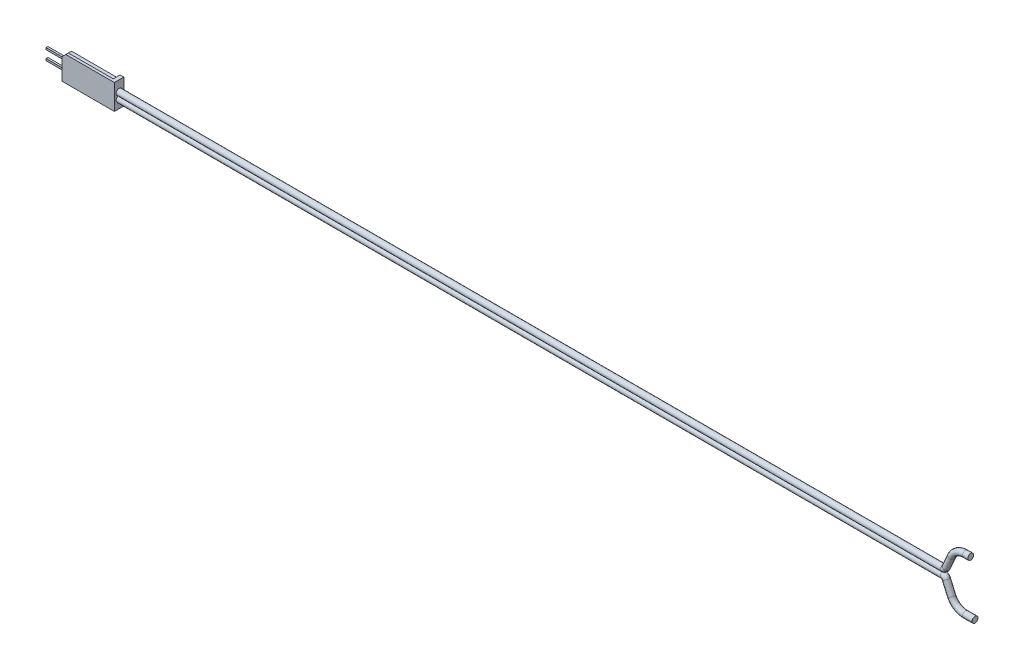
ISO-10303-21;
HEADER;
FILE_DESCRIPTION(('STEP AP214'),'2;1');
FILE_NAME('part.step','',(''),(''),'','','');
FILE_SCHEMA(('AUTOMOTIVE_DESIGN { 1 0 10303 214 1 1 1 1 }'));
ENDSEC;
DATA;
#1=APPLICATION_CONTEXT('core data for automotive mechanical design processes');
#2=APPLICATION_PROTOCOL_DEFINITION('international standard','automotive_design',2000,#1);
#3=PRODUCT_CONTEXT('',#1,'mechanical');
#4=PRODUCT('Part','Part','',(#3));
#5=PRODUCT_RELATED_PRODUCT_CATEGORY('part','',(#4));
#6=PRODUCT_DEFINITION_FORMATION('','',#4);
#7=PRODUCT_DEFINITION_CONTEXT('part definition',#1,'design');
#8=PRODUCT_DEFINITION('design','',#6,#7);
#9=PRODUCT_DEFINITION_SHAPE('','',#8);
#10=(LENGTH_UNIT() NAMED_UNIT(*) SI_UNIT(.MILLI.,.METRE.));
#11=(NAMED_UNIT(*) PLANE_ANGLE_UNIT() SI_UNIT($,.RADIAN.));
#12=(NAMED_UNIT(*) SI_UNIT($,.STERADIAN.) SOLID_ANGLE_UNIT());
#13=UNCERTAINTY_MEASURE_WITH_UNIT(LENGTH_MEASURE(1.E-05),#10,'distance_accuracy_value','');
#14=(GEOMETRIC_REPRESENTATION_CONTEXT(3) GLOBAL_UNCERTAINTY_ASSIGNED_CONTEXT((#13)) GLOBAL_UNIT_ASSIGNED_CONTEXT((#10,
#11,#12)) REPRESENTATION_CONTEXT('',''));
#15=CARTESIAN_POINT('',(0.,0.,0.));
#16=DIRECTION('',(0.,0.,1.));
#17=DIRECTION('',(1.,0.,0.));
#18=AXIS2_PLACEMENT_3D('',#15,#16,#17);
#19=CARTESIAN_POINT('',(-7.,-1.007199924,-0.25));
#20=DIRECTION('',(0.,0.,-1.));
#21=DIRECTION('',(-1.,0.,0.));
#22=AXIS2_PLACEMENT_3D('',#19,#20,#21);
#23=PLANE('',#22);
#24=DIRECTION('',(1.,0.,0.));
#25=VECTOR('',#24,1.);
#26=CARTESIAN_POINT('',(-7.,-1.507199924,-0.25));
#27=LINE('',#26,#25);
#28=CARTESIAN_POINT('',(-12.3,-1.507199924,-0.25));
#29=VERTEX_POINT('',#28);
#30=CARTESIAN_POINT('',(-7.,-1.507199924,-0.25));
#31=VERTEX_POINT('',#30);
#32=EDGE_CURVE('P0_E128',#29,#31,#27,.T.);
#33=ORIENTED_EDGE('',*,*,#32,.F.);
#34=DIRECTION('',(0.,1.,0.));
#35=VECTOR('',#34,1.);
#36=CARTESIAN_POINT('',(-12.3,-1.007199924,-0.25));
#37=LINE('',#36,#35);
#38=CARTESIAN_POINT('',(-12.3,-1.007199924,-0.25));
#39=VERTEX_POINT('',#38);
#40=EDGE_CURVE('P0_E133',#29,#39,#37,.T.);
#41=ORIENTED_EDGE('',*,*,#40,.T.);
#42=DIRECTION('',(1.,0.,0.));
#43=VECTOR('',#42,1.);
#44=CARTESIAN_POINT('',(-7.,-1.007199924,-0.25));
#45=LINE('',#44,#43);
#46=CARTESIAN_POINT('',(-7.,-1.007199924,-0.25));
#47=VERTEX_POINT('',#46);
#48=EDGE_CURVE('P0_E131',#47,#39,#45,.F.);
#49=ORIENTED_EDGE('',*,*,#48,.F.);
#50=DIRECTION('',(0.,1.,0.));
#51=VECTOR('',#50,1.);
#52=CARTESIAN_POINT('',(-7.,-1.007199924,-0.25));
#53=LINE('',#52,#51);
#54=EDGE_CURVE('P0_E20',#47,#31,#53,.F.);
#55=ORIENTED_EDGE('',*,*,#54,.T.);
#56=EDGE_LOOP('',(#33,#41,#49,#55));
#57=FACE_BOUND('',#56,.T.);
#58=ADVANCED_FACE('P0_F17',(#57),#23,.T.);
#59=CARTESIAN_POINT('',(-7.,1.532800076,-0.25));
#60=DIRECTION('',(0.,0.,-1.));
#61=DIRECTION('',(-1.,0.,0.));
#62=AXIS2_PLACEMENT_3D('',#59,#60,#61);
#63=PLANE('',#62);
#64=DIRECTION('',(1.,0.,0.));
#65=VECTOR('',#64,1.);
#66=CARTESIAN_POINT('',(-7.,1.032800076,-0.25));
#67=LINE('',#66,#65);
#68=CARTESIAN_POINT('',(-12.3,1.032800076,-0.25));
#69=VERTEX_POINT('',#68);
#70=CARTESIAN_POINT('',(-7.,1.032800076,-0.25));
#71=VERTEX_POINT('',#70);
#72=EDGE_CURVE('P0_E166',#69,#71,#67,.T.);
#73=ORIENTED_EDGE('',*,*,#72,.F.);
#74=DIRECTION('',(0.,1.,0.));
#75=VECTOR('',#74,1.);
#76=CARTESIAN_POINT('',(-12.3,1.532800076,-0.25));
#77=LINE('',#76,#75);
#78=CARTESIAN_POINT('',(-12.3,1.532800076,-0.25));
#79=VERTEX_POINT('',#78);
#80=EDGE_CURVE('P0_E147',#69,#79,#77,.T.);
#81=ORIENTED_EDGE('',*,*,#80,.T.);
#82=DIRECTION('',(1.,0.,0.));
#83=VECTOR('',#82,1.);
#84=CARTESIAN_POINT('',(-7.,1.532800076,-0.25));
#85=LINE('',#84,#83);
#86=CARTESIAN_POINT('',(-7.,1.532800076,-0.25));
#87=VERTEX_POINT('',#86);
#88=EDGE_CURVE('P0_E176',#87,#79,#85,.F.);
#89=ORIENTED_EDGE('',*,*,#88,.F.);
#90=DIRECTION('',(0.,1.,0.));
#91=VECTOR('',#90,1.);
#92=CARTESIAN_POINT('',(-7.,1.532800076,-0.25));
#93=LINE('',#92,#91);
#94=EDGE_CURVE('P0_E149',#87,#71,#93,.F.);
#95=ORIENTED_EDGE('',*,*,#94,.T.);
#96=EDGE_LOOP('',(#73,#81,#89,#95));
#97=FACE_BOUND('',#96,.T.);
#98=ADVANCED_FACE('P0_F412',(#97),#63,.T.);
#99=CARTESIAN_POINT('',(-7.,-1.507199924,-0.25));
#100=DIRECTION('',(0.,-1.,0.));
#101=DIRECTION('',(0.,0.,-1.));
#102=AXIS2_PLACEMENT_3D('',#99,#100,#101);
#103=PLANE('',#102);
#104=DIRECTION('',(1.,0.,0.));
#105=VECTOR('',#104,1.);
#106=CARTESIAN_POINT('',(-7.,-1.507199924,0.25));
#107=LINE('',#106,#105);
#108=CARTESIAN_POINT('',(-12.3,-1.507199924,0.25));
#109=VERTEX_POINT('',#108);
#110=CARTESIAN_POINT('',(-7.,-1.507199924,0.25));
#111=VERTEX_POINT('',#110);
#112=EDGE_CURVE('P0_E195',#109,#111,#107,.T.);
#113=ORIENTED_EDGE('',*,*,#112,.F.);
#114=DIRECTION('',(0.,0.,1.));
#115=VECTOR('',#114,1.);
#116=CARTESIAN_POINT('',(-12.3,-1.507199924,-1.27));
#117=LINE('',#116,#115);
#118=EDGE_CURVE('P0_E146',#29,#109,#117,.T.);
#119=ORIENTED_EDGE('',*,*,#118,.F.);
#120=ORIENTED_EDGE('',*,*,#32,.T.);
#121=DIRECTION('',(0.,0.,-1.));
#122=VECTOR('',#121,1.);
#123=CARTESIAN_POINT('',(-7.,-1.507199924,-0.25));
#124=LINE('',#123,#122);
#125=EDGE_CURVE('P0_E135',#31,#111,#124,.F.);
#126=ORIENTED_EDGE('',*,*,#125,.T.);
#127=EDGE_LOOP('',(#113,#119,#120,#126));
#128=FACE_BOUND('',#127,.T.);
#129=ADVANCED_FACE('P0_F144',(#128),#103,.T.);
#130=CARTESIAN_POINT('',(-7.,-1.007199924,0.25));
#131=DIRECTION('',(0.,1.,0.));
#132=DIRECTION('',(0.,0.,1.));
#133=AXIS2_PLACEMENT_3D('',#130,#131,#132);
#134=PLANE('',#133);
#135=ORIENTED_EDGE('',*,*,#48,.T.);
#136=DIRECTION('',(0.,0.,1.));
#137=VECTOR('',#136,1.);
#138=CARTESIAN_POINT('',(-12.3,-1.007199924,-1.27));
#139=LINE('',#138,#137);
#140=CARTESIAN_POINT('',(-12.3,-1.007199924,0.25));
#141=VERTEX_POINT('',#140);
#142=EDGE_CURVE('P0_E158',#141,#39,#139,.F.);
#143=ORIENTED_EDGE('',*,*,#142,.F.);
#144=DIRECTION('',(1.,0.,0.));
#145=VECTOR('',#144,1.);
#146=CARTESIAN_POINT('',(-7.,-1.007199924,0.25));
#147=LINE('',#146,#145);
#148=CARTESIAN_POINT('',(-7.,-1.007199924,0.25));
#149=VERTEX_POINT('',#148);
#150=EDGE_CURVE('P0_E197',#149,#141,#147,.F.);
#151=ORIENTED_EDGE('',*,*,#150,.F.);
#152=DIRECTION('',(0.,0.,1.));
#153=VECTOR('',#152,1.);
#154=CARTESIAN_POINT('',(-7.,-1.007199924,0.25));
#155=LINE('',#154,#153);
#156=EDGE_CURVE('P0_E142',#149,#47,#155,.F.);
#157=ORIENTED_EDGE('',*,*,#156,.T.);
#158=EDGE_LOOP('',(#135,#143,#151,#157));
#159=FACE_BOUND('',#158,.T.);
#160=ADVANCED_FACE('P0_F156',(#159),#134,.T.);
#161=CARTESIAN_POINT('',(-12.3,-1.257199924,-1.27));
#162=DIRECTION('',(-1.,0.,0.));
#163=DIRECTION('',(0.,0.,1.));
#164=AXIS2_PLACEMENT_3D('',#161,#162,#163);
#165=PLANE('',#164);
#166=ORIENTED_EDGE('',*,*,#118,.T.);
#167=DIRECTION('',(0.,1.,0.));
#168=VECTOR('',#167,1.);
#169=CARTESIAN_POINT('',(-12.3,-1.507199924,0.25));
#170=LINE('',#169,#168);
#171=EDGE_CURVE('P0_E163',#141,#109,#170,.F.);
#172=ORIENTED_EDGE('',*,*,#171,.F.);
#173=ORIENTED_EDGE('',*,*,#142,.T.);
#174=ORIENTED_EDGE('',*,*,#40,.F.);
#175=EDGE_LOOP('',(#166,#172,#173,#174));
#176=FACE_BOUND('',#175,.T.);
#177=ADVANCED_FACE('P0_F161',(#176),#165,.T.);
#178=CARTESIAN_POINT('',(-7.,1.032800076,-0.25));
#179=DIRECTION('',(0.,-1.,0.));
#180=DIRECTION('',(0.,0.,-1.));
#181=AXIS2_PLACEMENT_3D('',#178,#179,#180);
#182=PLANE('',#181);
#183=DIRECTION('',(1.,0.,0.));
#184=VECTOR('',#183,1.);
#185=CARTESIAN_POINT('',(-7.,1.032800076,0.25));
#186=LINE('',#185,#184);
#187=CARTESIAN_POINT('',(-12.3,1.032800076,0.25));
#188=VERTEX_POINT('',#187);
#189=CARTESIAN_POINT('',(-7.,1.032800076,0.25));
#190=VERTEX_POINT('',#189);
#191=EDGE_CURVE('P0_E200',#188,#190,#186,.T.);
#192=ORIENTED_EDGE('',*,*,#191,.F.);
#193=DIRECTION('',(0.,0.,1.));
#194=VECTOR('',#193,1.);
#195=CARTESIAN_POINT('',(-12.3,1.032800076,-1.27));
#196=LINE('',#195,#194);
#197=EDGE_CURVE('P0_E182',#69,#188,#196,.T.);
#198=ORIENTED_EDGE('',*,*,#197,.F.);
#199=ORIENTED_EDGE('',*,*,#72,.T.);
#200=DIRECTION('',(0.,0.,-1.));
#201=VECTOR('',#200,1.);
#202=CARTESIAN_POINT('',(-7.,1.032800076,-0.25));
#203=LINE('',#202,#201);
#204=EDGE_CURVE('P0_E171',#71,#190,#203,.F.);
#205=ORIENTED_EDGE('',*,*,#204,.T.);
#206=EDGE_LOOP('',(#192,#198,#199,#205));
#207=FACE_BOUND('',#206,.T.);
#208=ADVANCED_FACE('P0_F385',(#207),#182,.T.);
#209=CARTESIAN_POINT('',(-7.,1.532800076,0.25));
#210=DIRECTION('',(0.,1.,0.));
#211=DIRECTION('',(0.,0.,1.));
#212=AXIS2_PLACEMENT_3D('',#209,#210,#211);
#213=PLANE('',#212);
#214=ORIENTED_EDGE('',*,*,#88,.T.);
#215=DIRECTION('',(0.,0.,1.));
#216=VECTOR('',#215,1.);
#217=CARTESIAN_POINT('',(-12.3,1.532800076,-1.27));
#218=LINE('',#217,#216);
#219=CARTESIAN_POINT('',(-12.3,1.532800076,0.25));
#220=VERTEX_POINT('',#219);
#221=EDGE_CURVE('P0_E179',#220,#79,#218,.F.);
#222=ORIENTED_EDGE('',*,*,#221,.F.);
#223=DIRECTION('',(1.,0.,0.));
#224=VECTOR('',#223,1.);
#225=CARTESIAN_POINT('',(-7.,1.532800076,0.25));
#226=LINE('',#225,#224);
#227=CARTESIAN_POINT('',(-7.,1.532800076,0.25));
#228=VERTEX_POINT('',#227);
#229=EDGE_CURVE('P0_E203',#228,#220,#226,.F.);
#230=ORIENTED_EDGE('',*,*,#229,.F.);
#231=DIRECTION('',(0.,0.,1.));
#232=VECTOR('',#231,1.);
#233=CARTESIAN_POINT('',(-7.,1.532800076,0.25));
#234=LINE('',#233,#232);
#235=EDGE_CURVE('P0_E173',#228,#87,#234,.F.);
#236=ORIENTED_EDGE('',*,*,#235,.T.);
#237=EDGE_LOOP('',(#214,#222,#230,#236));
#238=FACE_BOUND('',#237,.T.);
#239=ADVANCED_FACE('P0_F297',(#238),#213,.T.);
#240=CARTESIAN_POINT('',(-12.3,-1.257199924,-1.27));
#241=DIRECTION('',(-1.,0.,0.));
#242=DIRECTION('',(0.,0.,1.));
#243=AXIS2_PLACEMENT_3D('',#240,#241,#242);
#244=PLANE('',#243);
#245=ORIENTED_EDGE('',*,*,#197,.T.);
#246=DIRECTION('',(0.,1.,0.));
#247=VECTOR('',#246,1.);
#248=CARTESIAN_POINT('',(-12.3,1.032800076,0.25));
#249=LINE('',#248,#247);
#250=EDGE_CURVE('P0_E206',#220,#188,#249,.F.);
#251=ORIENTED_EDGE('',*,*,#250,.F.);
#252=ORIENTED_EDGE('',*,*,#221,.T.);
#253=ORIENTED_EDGE('',*,*,#80,.F.);
#254=EDGE_LOOP('',(#245,#251,#252,#253));
#255=FACE_BOUND('',#254,.T.);
#256=ADVANCED_FACE('P0_F289',(#255),#244,.T.);
#257=CARTESIAN_POINT('',(6.,2.592800076,-2.68421356237309));
#258=DIRECTION('',(1.,0.,0.));
#259=DIRECTION('',(0.,0.,-1.));
#260=AXIS2_PLACEMENT_3D('',#257,#258,#259);
#261=PLANE('',#260);
#262=DIRECTION('',(0.,1.,0.));
#263=VECTOR('',#262,1.);
#264=CARTESIAN_POINT('',(6.,-1.257199924,-1.27));
#265=LINE('',#264,#263);
#266=CARTESIAN_POINT('',(6.,3.592800076,-1.27));
#267=VERTEX_POINT('',#266);
#268=CARTESIAN_POINT('',(6.,2.592800076,-1.27));
#269=VERTEX_POINT('',#268);
#270=EDGE_CURVE('P0_E209',#267,#269,#265,.F.);
#271=ORIENTED_EDGE('',*,*,#270,.T.);
#272=DIRECTION('',(0.,0.,1.));
#273=VECTOR('',#272,1.);
#274=CARTESIAN_POINT('',(6.,2.592800076,-1.27));
#275=LINE('',#274,#273);
#276=CARTESIAN_POINT('',(6.,2.592800076,0.57));
#277=VERTEX_POINT('',#276);
#278=EDGE_CURVE('P0_E192',#277,#269,#275,.F.);
#279=ORIENTED_EDGE('',*,*,#278,.F.);
#280=DIRECTION('',(0.,1.,0.));
#281=VECTOR('',#280,1.);
#282=CARTESIAN_POINT('',(6.,2.592800076,0.57));
#283=LINE('',#282,#281);
#284=CARTESIAN_POINT('',(6.,3.592800076,0.57));
#285=VERTEX_POINT('',#284);
#286=EDGE_CURVE('P0_E185',#285,#277,#283,.F.);
#287=ORIENTED_EDGE('',*,*,#286,.F.);
#288=DIRECTION('',(0.,0.,1.));
#289=VECTOR('',#288,1.);
#290=CARTESIAN_POINT('',(6.,3.592800076,0.47));
#291=LINE('',#290,#289);
#292=EDGE_CURVE('P0_E213',#267,#285,#291,.T.);
#293=ORIENTED_EDGE('',*,*,#292,.F.);
#294=EDGE_LOOP('',(#271,#279,#287,#293));
#295=FACE_BOUND('',#294,.T.);
#296=ADVANCED_FACE('P0_F287',(#295),#261,.F.);
#297=CARTESIAN_POINT('',(6.,2.592800076,0.57));
#298=DIRECTION('',(0.,0.,-1.));
#299=DIRECTION('',(-1.,0.,0.));
#300=AXIS2_PLACEMENT_3D('',#297,#298,#299);
#301=PLANE('',#300);
#302=DIRECTION('',(0.707106781186549,0.707106781186546,0.));
#303=VECTOR('',#302,1.);
#304=CARTESIAN_POINT('',(-7.,2.592800076,0.57));
#305=LINE('',#304,#303);
#306=CARTESIAN_POINT('',(-7.00000000000001,2.592800076,0.57));
#307=VERTEX_POINT('',#306);
#308=CARTESIAN_POINT('',(-6.,3.592800076,0.57));
#309=VERTEX_POINT('',#308);
#310=EDGE_CURVE('P0_E187',#307,#309,#305,.T.);
#311=ORIENTED_EDGE('',*,*,#310,.T.);
#312=DIRECTION('',(1.,0.,0.));
#313=VECTOR('',#312,1.);
#314=CARTESIAN_POINT('',(-7.,3.592800076,0.57));
#315=LINE('',#314,#313);
#316=EDGE_CURVE('P0_E216',#285,#309,#315,.F.);
#317=ORIENTED_EDGE('',*,*,#316,.F.);
#318=ORIENTED_EDGE('',*,*,#286,.T.);
#319=DIRECTION('',(1.,0.,0.));
#320=VECTOR('',#319,1.);
#321=CARTESIAN_POINT('',(7.,2.592800076,0.57));
#322=LINE('',#321,#320);
#323=EDGE_CURVE('P0_E189',#307,#277,#322,.T.);
#324=ORIENTED_EDGE('',*,*,#323,.F.);
#325=EDGE_LOOP('',(#311,#317,#318,#324));
#326=FACE_BOUND('',#325,.T.);
#327=ADVANCED_FACE('P0_F282',(#326),#301,.T.);
#328=CARTESIAN_POINT('',(7.,2.592800076,-1.27));
#329=DIRECTION('',(0.,1.,0.));
#330=DIRECTION('',(0.,0.,1.));
#331=AXIS2_PLACEMENT_3D('',#328,#329,#330);
#332=PLANE('',#331);
#333=ORIENTED_EDGE('',*,*,#278,.T.);
#334=DIRECTION('',(1.,0.,0.));
#335=VECTOR('',#334,1.);
#336=CARTESIAN_POINT('',(0.,2.592800076,-1.27));
#337=LINE('',#336,#335);
#338=CARTESIAN_POINT('',(-7.,2.592800076,-1.27));
#339=VERTEX_POINT('',#338);
#340=EDGE_CURVE('P0_E211',#269,#339,#337,.F.);
#341=ORIENTED_EDGE('',*,*,#340,.T.);
#342=DIRECTION('',(0.,0.,1.));
#343=VECTOR('',#342,1.);
#344=CARTESIAN_POINT('',(-7.,2.592800076,-1.27));
#345=LINE('',#344,#343);
#346=EDGE_CURVE('P0_E227',#307,#339,#345,.F.);
#347=ORIENTED_EDGE('',*,*,#346,.F.);
#348=ORIENTED_EDGE('',*,*,#323,.T.);
#349=EDGE_LOOP('',(#333,#341,#347,#348));
#350=FACE_BOUND('',#349,.T.);
#351=ADVANCED_FACE('P0_F285',(#350),#332,.T.);
#352=CARTESIAN_POINT('',(-7.,-1.507199924,0.25));
#353=DIRECTION('',(0.,0.,1.));
#354=DIRECTION('',(1.,0.,0.));
#355=AXIS2_PLACEMENT_3D('',#352,#353,#354);
#356=PLANE('',#355);
#357=ORIENTED_EDGE('',*,*,#150,.T.);
#358=ORIENTED_EDGE('',*,*,#171,.T.);
#359=ORIENTED_EDGE('',*,*,#112,.T.);
#360=DIRECTION('',(0.,1.,0.));
#361=VECTOR('',#360,1.);
#362=CARTESIAN_POINT('',(-7.,2.592800076,0.25));
#363=LINE('',#362,#361);
#364=EDGE_CURVE('P0_E139',#149,#111,#363,.F.);
#365=ORIENTED_EDGE('',*,*,#364,.F.);
#366=EDGE_LOOP('',(#357,#358,#359,#365));
#367=FACE_BOUND('',#366,.T.);
#368=ADVANCED_FACE('P0_F321',(#367),#356,.T.);
#369=CARTESIAN_POINT('',(-7.,1.032800076,0.25));
#370=DIRECTION('',(0.,0.,1.));
#371=DIRECTION('',(1.,0.,0.));
#372=AXIS2_PLACEMENT_3D('',#369,#370,#371);
#373=PLANE('',#372);
#374=ORIENTED_EDGE('',*,*,#229,.T.);
#375=ORIENTED_EDGE('',*,*,#250,.T.);
#376=ORIENTED_EDGE('',*,*,#191,.T.);
#377=DIRECTION('',(0.,1.,0.));
#378=VECTOR('',#377,1.);
#379=CARTESIAN_POINT('',(-7.,2.592800076,0.25));
#380=LINE('',#379,#378);
#381=EDGE_CURVE('P0_E233',#228,#190,#380,.F.);
#382=ORIENTED_EDGE('',*,*,#381,.F.);
#383=EDGE_LOOP('',(#374,#375,#376,#382));
#384=FACE_BOUND('',#383,.T.);
#385=ADVANCED_FACE('P0_F318',(#384),#373,.T.);
#386=CARTESIAN_POINT('',(0.,-1.257199924,-1.27));
#387=DIRECTION('',(0.,0.,1.));
#388=DIRECTION('',(1.,0.,0.));
#389=AXIS2_PLACEMENT_3D('',#386,#387,#388);
#390=PLANE('',#389);
#391=DIRECTION('',(1.,0.,0.));
#392=VECTOR('',#391,1.);
#393=CARTESIAN_POINT('',(156.887568848328,-3.107199924,-1.27));
#394=LINE('',#393,#392);
#395=CARTESIAN_POINT('',(7.,-3.107199924,-1.27));
#396=VERTEX_POINT('',#395);
#397=CARTESIAN_POINT('',(-7.,-3.107199924,-1.27));
#398=VERTEX_POINT('',#397);
#399=EDGE_CURVE('P0_E238',#396,#398,#394,.F.);
#400=ORIENTED_EDGE('',*,*,#399,.T.);
#401=DIRECTION('',(0.,1.,0.));
#402=VECTOR('',#401,1.);
#403=CARTESIAN_POINT('',(-7.,2.592800076,-1.27));
#404=LINE('',#403,#402);
#405=EDGE_CURVE('P0_E230',#339,#398,#404,.F.);
#406=ORIENTED_EDGE('',*,*,#405,.F.);
#407=ORIENTED_EDGE('',*,*,#340,.F.);
#408=ORIENTED_EDGE('',*,*,#270,.F.);
#409=DIRECTION('',(1.,0.,0.));
#410=VECTOR('',#409,1.);
#411=CARTESIAN_POINT('',(-7.,3.592800076,-1.27));
#412=LINE('',#411,#410);
#413=CARTESIAN_POINT('',(7.,3.592800076,-1.27));
#414=VERTEX_POINT('',#413);
#415=EDGE_CURVE('P0_E219',#414,#267,#412,.F.);
#416=ORIENTED_EDGE('',*,*,#415,.F.);
#417=DIRECTION('',(0.,1.,0.));
#418=VECTOR('',#417,1.);
#419=CARTESIAN_POINT('',(7.,-5.107199924,-1.27));
#420=LINE('',#419,#418);
#421=EDGE_CURVE('P0_E242',#396,#414,#420,.T.);
#422=ORIENTED_EDGE('',*,*,#421,.F.);
#423=EDGE_LOOP('',(#400,#406,#407,#408,#416,#422));
#424=FACE_BOUND('',#423,.T.);
#425=ADVANCED_FACE('P0_F268',(#424),#390,.F.);
#426=CARTESIAN_POINT('',(-7.,3.592800076,0.47));
#427=DIRECTION('',(0.,1.,0.));
#428=DIRECTION('',(0.,0.,1.));
#429=AXIS2_PLACEMENT_3D('',#426,#427,#428);
#430=PLANE('',#429);
#431=DIRECTION('',(0.,0.,-1.));
#432=VECTOR('',#431,1.);
#433=CARTESIAN_POINT('',(7.,3.592800076,-1.27));
#434=LINE('',#433,#432);
#435=CARTESIAN_POINT('',(7.,3.592800076,1.27));
#436=VERTEX_POINT('',#435);
#437=EDGE_CURVE('P0_E245',#414,#436,#434,.F.);
#438=ORIENTED_EDGE('',*,*,#437,.F.);
#439=ORIENTED_EDGE('',*,*,#415,.T.);
#440=ORIENTED_EDGE('',*,*,#292,.T.);
#441=ORIENTED_EDGE('',*,*,#316,.T.);
#442=DIRECTION('',(0.,0.,1.));
#443=VECTOR('',#442,1.);
#444=CARTESIAN_POINT('',(-6.,3.592800076,-1.27));
#445=LINE('',#444,#443);
#446=CARTESIAN_POINT('',(-6.,3.592800076,1.27));
#447=VERTEX_POINT('',#446);
#448=EDGE_CURVE('P0_E222',#309,#447,#445,.T.);
#449=ORIENTED_EDGE('',*,*,#448,.T.);
#450=DIRECTION('',(1.,0.,0.));
#451=VECTOR('',#450,1.);
#452=CARTESIAN_POINT('',(0.,3.592800076,1.27));
#453=LINE('',#452,#451);
#454=EDGE_CURVE('P0_E248',#436,#447,#453,.F.);
#455=ORIENTED_EDGE('',*,*,#454,.F.);
#456=EDGE_LOOP('',(#438,#439,#440,#441,#449,#455));
#457=FACE_BOUND('',#456,.T.);
#458=ADVANCED_FACE('P0_F274',(#457),#430,.T.);
#459=CARTESIAN_POINT('',(-7.,2.592800076,-1.27));
#460=DIRECTION('',(0.707106781186546,-0.707106781186549,0.));
#461=DIRECTION('',(0.707106781186549,0.707106781186546,0.));
#462=AXIS2_PLACEMENT_3D('',#459,#460,#461);
#463=PLANE('',#462);
#464=ORIENTED_EDGE('',*,*,#310,.F.);
#465=DIRECTION('',(0.,0.,1.));
#466=VECTOR('',#465,1.);
#467=CARTESIAN_POINT('',(-7.,2.592800076,-1.27));
#468=LINE('',#467,#466);
#469=CARTESIAN_POINT('',(-7.,2.592800076,1.27));
#470=VERTEX_POINT('',#469);
#471=EDGE_CURVE('P0_E224',#470,#307,#468,.F.);
#472=ORIENTED_EDGE('',*,*,#471,.F.);
#473=DIRECTION('',(-0.707106781186549,-0.707106781186546,0.));
#474=VECTOR('',#473,1.);
#475=CARTESIAN_POINT('',(-6.,3.592800076,1.27));
#476=LINE('',#475,#474);
#477=EDGE_CURVE('P0_E251',#447,#470,#476,.T.);
#478=ORIENTED_EDGE('',*,*,#477,.F.);
#479=ORIENTED_EDGE('',*,*,#448,.F.);
#480=EDGE_LOOP('',(#464,#472,#478,#479));
#481=FACE_BOUND('',#480,.T.);
#482=ADVANCED_FACE('P0_F278',(#481),#463,.F.);
#483=CARTESIAN_POINT('',(-7.,2.592800076,-1.27));
#484=DIRECTION('',(-1.,0.,0.));
#485=DIRECTION('',(0.,0.,1.));
#486=AXIS2_PLACEMENT_3D('',#483,#484,#485);
#487=PLANE('',#486);
#488=ORIENTED_EDGE('',*,*,#235,.F.);
#489=ORIENTED_EDGE('',*,*,#381,.T.);
#490=ORIENTED_EDGE('',*,*,#204,.F.);
#491=ORIENTED_EDGE('',*,*,#94,.F.);
#492=EDGE_LOOP('',(#488,#489,#490,#491));
#493=FACE_BOUND('',#492,.T.);
#494=ORIENTED_EDGE('',*,*,#156,.F.);
#495=ORIENTED_EDGE('',*,*,#364,.T.);
#496=ORIENTED_EDGE('',*,*,#125,.F.);
#497=ORIENTED_EDGE('',*,*,#54,.F.);
#498=EDGE_LOOP('',(#494,#495,#496,#497));
#499=FACE_BOUND('',#498,.T.);
#500=ORIENTED_EDGE('',*,*,#405,.T.);
#501=DIRECTION('',(0.,0.,1.));
#502=VECTOR('',#501,1.);
#503=CARTESIAN_POINT('',(-7.00000000000001,-3.107199924,1.27));
#504=LINE('',#503,#502);
#505=CARTESIAN_POINT('',(-7.,-3.107199924,1.27));
#506=VERTEX_POINT('',#505);
#507=EDGE_CURVE('P0_E236',#398,#506,#504,.T.);
#508=ORIENTED_EDGE('',*,*,#507,.T.);
#509=DIRECTION('',(0.,1.,0.));
#510=VECTOR('',#509,1.);
#511=CARTESIAN_POINT('',(-7.,-1.257199924,1.27));
#512=LINE('',#511,#510);
#513=EDGE_CURVE('P0_E254',#470,#506,#512,.F.);
#514=ORIENTED_EDGE('',*,*,#513,.F.);
#515=ORIENTED_EDGE('',*,*,#471,.T.);
#516=ORIENTED_EDGE('',*,*,#346,.T.);
#517=EDGE_LOOP('',(#500,#508,#514,#515,#516));
#518=FACE_BOUND('',#517,.T.);
#519=ADVANCED_FACE('P0_F136',(#493,#499,#518),#487,.T.);
#520=CARTESIAN_POINT('',(156.887568848328,-3.107199924,1.27));
#521=DIRECTION('',(0.,1.,0.));
#522=DIRECTION('',(0.,0.,1.));
#523=AXIS2_PLACEMENT_3D('',#520,#521,#522);
#524=PLANE('',#523);
#525=DIRECTION('',(0.,0.,-1.));
#526=VECTOR('',#525,1.);
#527=CARTESIAN_POINT('',(7.,-3.107199924,-1.27));
#528=LINE('',#527,#526);
#529=CARTESIAN_POINT('',(7.,-3.107199924,1.27));
#530=VERTEX_POINT('',#529);
#531=EDGE_CURVE('P0_E35',#530,#396,#528,.T.);
#532=ORIENTED_EDGE('',*,*,#531,.F.);
#533=DIRECTION('',(1.,0.,0.));
#534=VECTOR('',#533,1.);
#535=CARTESIAN_POINT('',(0.,-3.107199924,1.27));
#536=LINE('',#535,#534);
#537=EDGE_CURVE('P0_E26',#506,#530,#536,.T.);
#538=ORIENTED_EDGE('',*,*,#537,.F.);
#539=ORIENTED_EDGE('',*,*,#507,.F.);
#540=ORIENTED_EDGE('',*,*,#399,.F.);
#541=EDGE_LOOP('',(#532,#538,#539,#540));
#542=FACE_BOUND('',#541,.T.);
#543=ADVANCED_FACE('P0_F262',(#542),#524,.F.);
#544=CARTESIAN_POINT('',(7.,-5.107199924,-1.27));
#545=DIRECTION('',(1.,0.,0.));
#546=DIRECTION('',(0.,0.,-1.));
#547=AXIS2_PLACEMENT_3D('',#544,#545,#546);
#548=PLANE('',#547);
#549=ORIENTED_EDGE('',*,*,#437,.T.);
#550=DIRECTION('',(0.,1.,0.));
#551=VECTOR('',#550,1.);
#552=CARTESIAN_POINT('',(7.,-1.257199924,1.27));
#553=LINE('',#552,#551);
#554=EDGE_CURVE('P0_E11',#530,#436,#553,.T.);
#555=ORIENTED_EDGE('',*,*,#554,.F.);
#556=ORIENTED_EDGE('',*,*,#531,.T.);
#557=ORIENTED_EDGE('',*,*,#421,.T.);
#558=EDGE_LOOP('',(#549,#555,#556,#557));
#559=FACE_BOUND('',#558,.T.);
#560=ADVANCED_FACE('P0_F272',(#559),#548,.T.);
#561=CARTESIAN_POINT('',(0.,-1.257199924,1.27));
#562=DIRECTION('',(0.,0.,1.));
#563=DIRECTION('',(1.,0.,0.));
#564=AXIS2_PLACEMENT_3D('',#561,#562,#563);
#565=PLANE('',#564);
#566=ORIENTED_EDGE('',*,*,#537,.T.);
#567=ORIENTED_EDGE('',*,*,#554,.T.);
#568=ORIENTED_EDGE('',*,*,#454,.T.);
#569=ORIENTED_EDGE('',*,*,#477,.T.);
#570=ORIENTED_EDGE('',*,*,#513,.T.);
#571=EDGE_LOOP('',(#566,#567,#568,#569,#570));
#572=FACE_BOUND('',#571,.T.);
#573=ADVANCED_FACE('P0_F259',(#572),#565,.T.);
#574=CLOSED_SHELL('',(#58,#98,#129,#160,#177,#208,#239,#256,#296,#327,#351,#368,#385,#425,#458,
#482,#519,#543,#560,#573));
#575=MANIFOLD_SOLID_BREP('P0_B1',#574);
#576=CARTESIAN_POINT('',(235.91,-6.99686707171975,0.));
#577=DIRECTION('',(1.,0.,0.));
#578=DIRECTION('',(0.,1.,0.));
#579=AXIS2_PLACEMENT_3D('',#576,#577,#578);
#580=PLANE('',#579);
#581=CARTESIAN_POINT('',(235.91,-6.99686707171975,0.));
#582=DIRECTION('',(1.,0.,0.));
#583=DIRECTION('',(0.,1.,0.));
#584=AXIS2_PLACEMENT_3D('',#581,#582,#583);
#585=CIRCLE('',#584,0.800000000000006);
#586=CARTESIAN_POINT('',(235.91,-6.19686707171974,0.));
#587=VERTEX_POINT('',#586);
#588=EDGE_CURVE('P1_E18',#587,#587,#585,.F.);
#589=ORIENTED_EDGE('',*,*,#588,.F.);
#590=EDGE_LOOP('',(#589));
#591=FACE_BOUND('',#590,.T.);
#592=ADVANCED_FACE('P1_F15',(#591),#580,.T.);
#593=CARTESIAN_POINT('',(233.37,-6.99686707171976,0.));
#594=DIRECTION('',(1.,0.,0.));
#595=DIRECTION('',(0.,1.,0.));
#596=AXIS2_PLACEMENT_3D('',#593,#594,#595);
#597=CYLINDRICAL_SURFACE('',#596,0.800000000000006);
#598=CARTESIAN_POINT('',(233.37,-6.99686707171976,0.));
#599=DIRECTION('',(1.,0.,0.));
#600=DIRECTION('',(0.,-1.,0.));
#601=AXIS2_PLACEMENT_3D('',#598,#599,#600);
#602=CIRCLE('',#601,0.800000000000006);
#603=CARTESIAN_POINT('',(233.37,-7.79686707171976,0.));
#604=VERTEX_POINT('',#603);
#605=EDGE_CURVE('P1_E34',#604,#604,#602,.F.);
#606=ORIENTED_EDGE('',*,*,#605,.F.);
#607=EDGE_LOOP('',(#606));
#608=FACE_BOUND('',#607,.T.);
#609=ORIENTED_EDGE('',*,*,#588,.T.);
#610=EDGE_LOOP('',(#609));
#611=FACE_BOUND('',#610,.T.);
#612=ADVANCED_FACE('P1_F43',(#608,#611),#597,.T.);
#613=CARTESIAN_POINT('',(233.37,-2.9207146987759,0.));
#614=DIRECTION('',(0.,0.,1.));
#615=DIRECTION('',(1.,0.,0.));
#616=AXIS2_PLACEMENT_3D('',#613,#614,#615);
#617=TOROIDAL_SURFACE('',#616,4.07615237294387,0.800000000000006);
#618=CARTESIAN_POINT('',(229.636644149097,-4.55689080726305,0.));
#619=DIRECTION('',(0.401402096581953,-0.915901936268077,0.));
#620=DIRECTION('',(0.915901936268077,0.401402096581953,0.));
#621=AXIS2_PLACEMENT_3D('',#618,#619,#620);
#622=CIRCLE('',#621,0.800000000000004);
#623=CARTESIAN_POINT('',(230.369365698111,-4.23576912999749,0.));
#624=VERTEX_POINT('',#623);
#625=EDGE_CURVE('P1_E31',#624,#624,#622,.F.);
#626=ORIENTED_EDGE('',*,*,#625,.F.);
#627=EDGE_LOOP('',(#626));
#628=FACE_BOUND('',#627,.T.);
#629=ORIENTED_EDGE('',*,*,#605,.T.);
#630=EDGE_LOOP('',(#629));
#631=FACE_BOUND('',#630,.T.);
#632=ADVANCED_FACE('P1_F39',(#628,#631),#617,.T.);
#633=CARTESIAN_POINT('',(228.220817134888,-1.32631798570251,0.));
#634=DIRECTION('',(0.401402096581953,-0.915901936268077,0.));
#635=DIRECTION('',(0.915901936268077,0.401402096581953,0.));
#636=AXIS2_PLACEMENT_3D('',#633,#634,#635);
#637=CYLINDRICAL_SURFACE('',#636,0.800000000000004);
#638=CARTESIAN_POINT('',(228.220817134888,-1.32631798570254,0.));
#639=DIRECTION('',(0.401402096581974,-0.915901936268068,0.));
#640=DIRECTION('',(0.915901936268068,0.401402096581974,0.));
#641=AXIS2_PLACEMENT_3D('',#638,#639,#640);
#642=CIRCLE('',#641,0.800000000000006);
#643=CARTESIAN_POINT('',(228.953538683902,-1.00519630843696,0.));
#644=VERTEX_POINT('',#643);
#645=EDGE_CURVE('P1_E27',#644,#644,#642,.F.);
#646=ORIENTED_EDGE('',*,*,#645,.F.);
#647=EDGE_LOOP('',(#646));
#648=FACE_BOUND('',#647,.T.);
#649=ORIENTED_EDGE('',*,*,#625,.T.);
#650=EDGE_LOOP('',(#649));
#651=FACE_BOUND('',#650,.T.);
#652=ADVANCED_FACE('P1_F42',(#648,#651),#637,.T.);
#653=CARTESIAN_POINT('',(7.01,-0.799999924,0.));
#654=DIRECTION('',(1.,0.,0.));
#655=DIRECTION('',(0.,0.,-1.));
#656=AXIS2_PLACEMENT_3D('',#653,#654,#655);
#657=PLANE('',#656);
#658=CARTESIAN_POINT('',(7.01,-0.799999924000001,0.));
#659=DIRECTION('',(1.,0.,0.));
#660=DIRECTION('',(0.,1.,0.));
#661=AXIS2_PLACEMENT_3D('',#658,#659,#660);
#662=CIRCLE('',#661,0.800000000000006);
#663=CARTESIAN_POINT('',(7.01,7.6000004683649E-08,0.));
#664=VERTEX_POINT('',#663);
#665=EDGE_CURVE('P1_E22',#664,#664,#662,.T.);
#666=ORIENTED_EDGE('',*,*,#665,.F.);
#667=EDGE_LOOP('',(#666));
#668=FACE_BOUND('',#667,.T.);
#669=ADVANCED_FACE('P1_F63',(#668),#657,.F.);
#670=CARTESIAN_POINT('',(227.41550904902,-1.67925135254194,0.));
#671=DIRECTION('',(0.,0.,-1.));
#672=DIRECTION('',(-1.,0.,0.));
#673=AXIS2_PLACEMENT_3D('',#670,#671,#672);
#674=TOROIDAL_SURFACE('',#673,0.879251428541838,0.800000000000006);
#675=ORIENTED_EDGE('',*,*,#645,.T.);
#676=EDGE_LOOP('',(#675));
#677=FACE_BOUND('',#676,.T.);
#678=CARTESIAN_POINT('',(227.41550904902,-0.799999924000377,-3.17731900053205E-13));
#679=DIRECTION('',(1.,0.,0.));
#680=DIRECTION('',(0.,1.,0.));
#681=AXIS2_PLACEMENT_3D('',#678,#679,#680);
#682=CIRCLE('',#681,0.800000000000006);
#683=CARTESIAN_POINT('',(227.41550904902,7.59996287907558E-08,-3.17731900053205E-13));
#684=VERTEX_POINT('',#683);
#685=EDGE_CURVE('P1_E10',#684,#684,#682,.F.);
#686=ORIENTED_EDGE('',*,*,#685,.F.);
#687=EDGE_LOOP('',(#686));
#688=FACE_BOUND('',#687,.T.);
#689=ADVANCED_FACE('P1_F57',(#677,#688),#674,.T.);
#690=CARTESIAN_POINT('',(6.01,-0.799999924,0.));
#691=DIRECTION('',(1.,0.,0.));
#692=DIRECTION('',(0.,1.,0.));
#693=AXIS2_PLACEMENT_3D('',#690,#691,#692);
#694=CYLINDRICAL_SURFACE('',#693,0.800000000000006);
#695=ORIENTED_EDGE('',*,*,#665,.T.);
#696=EDGE_LOOP('',(#695));
#697=FACE_BOUND('',#696,.T.);
#698=ORIENTED_EDGE('',*,*,#685,.T.);
#699=EDGE_LOOP('',(#698));
#700=FACE_BOUND('',#699,.T.);
#701=ADVANCED_FACE('P1_F55',(#697,#700),#694,.T.);
#702=CLOSED_SHELL('',(#592,#612,#632,#652,#669,#689,#701));
#703=MANIFOLD_SOLID_BREP('P1_B1',#702);
#704=CARTESIAN_POINT('',(234.771596629542,6.99686714772079,8.55189900363326E-13));
#705=DIRECTION('',(1.,0.,0.));
#706=DIRECTION('',(0.,1.,0.));
#707=AXIS2_PLACEMENT_3D('',#704,#705,#706);
#708=PLANE('',#707);
#709=CARTESIAN_POINT('',(234.771596629542,6.99686714772079,8.55189900363326E-13));
#710=DIRECTION('',(1.,0.,0.));
#711=DIRECTION('',(0.,1.,0.));
#712=AXIS2_PLACEMENT_3D('',#709,#710,#711);
#713=CIRCLE('',#712,0.799999999999449);
#714=CARTESIAN_POINT('',(234.771596629542,7.79686714772024,8.55189900363326E-13));
#715=VERTEX_POINT('',#714);
#716=EDGE_CURVE('P2_E18',#715,#715,#713,.F.);
#717=ORIENTED_EDGE('',*,*,#716,.F.);
#718=EDGE_LOOP('',(#717));
#719=FACE_BOUND('',#718,.T.);
#720=ADVANCED_FACE('P2_F15',(#719),#708,.T.);
#721=CARTESIAN_POINT('',(233.37,6.9968671477208,8.55189900363326E-13));
#722=DIRECTION('',(1.,0.,0.));
#723=DIRECTION('',(0.,1.,0.));
#724=AXIS2_PLACEMENT_3D('',#721,#722,#723);
#725=CYLINDRICAL_SURFACE('',#724,0.799999999999449);
#726=CARTESIAN_POINT('',(233.37,6.99686714772077,8.55189900363326E-13));
#727=DIRECTION('',(1.,0.,0.));
#728=DIRECTION('',(0.,1.,0.));
#729=AXIS2_PLACEMENT_3D('',#726,#727,#728);
#730=CIRCLE('',#729,0.799999999999449);
#731=CARTESIAN_POINT('',(233.37,7.79686714772022,8.55189900363326E-13));
#732=VERTEX_POINT('',#731);
#733=EDGE_CURVE('P2_E79',#732,#732,#730,.F.);
#734=ORIENTED_EDGE('',*,*,#733,.F.);
#735=EDGE_LOOP('',(#734));
#736=FACE_BOUND('',#735,.T.);
#737=ORIENTED_EDGE('',*,*,#716,.T.);
#738=EDGE_LOOP('',(#737));
#739=FACE_BOUND('',#738,.T.);
#740=ADVANCED_FACE('P2_F42',(#736,#739),#725,.T.);
#741=CARTESIAN_POINT('',(233.37,2.9207146987759,8.55189900363326E-13));
#742=DIRECTION('',(0.,0.,-1.));
#743=DIRECTION('',(-1.,0.,0.));
#744=AXIS2_PLACEMENT_3D('',#741,#742,#743);
#745=TOROIDAL_SURFACE('',#744,4.07615244894488,0.799999999999449);
#746=ORIENTED_EDGE('',*,*,#733,.T.);
#747=EDGE_LOOP('',(#746));
#748=FACE_BOUND('',#747,.T.);
#749=CARTESIAN_POINT('',(229.636644072568,4.55689082198199,8.55189900363326E-13));
#750=DIRECTION('',(0.401402116316983,0.915901927619026,0.));
#751=DIRECTION('',(-0.915901927619026,0.401402116316983,0.));
#752=AXIS2_PLACEMENT_3D('',#749,#750,#751);
#753=CIRCLE('',#752,0.799999999999455);
#754=CARTESIAN_POINT('',(228.903922530474,4.87801251503536,8.55189900363326E-13));
#755=VERTEX_POINT('',#754);
#756=EDGE_CURVE('P2_E33',#755,#755,#753,.F.);
#757=ORIENTED_EDGE('',*,*,#756,.F.);
#758=EDGE_LOOP('',(#757));
#759=FACE_BOUND('',#758,.T.);
#760=ADVANCED_FACE('P2_F38',(#748,#759),#745,.T.);
#761=CARTESIAN_POINT('',(228.220816995669,1.32631804671648,8.55189900363326E-13));
#762=DIRECTION('',(0.401402116316983,0.915901927619026,0.));
#763=DIRECTION('',(-0.915901927619026,0.401402116316983,0.));
#764=AXIS2_PLACEMENT_3D('',#761,#762,#763);
#765=CYLINDRICAL_SURFACE('',#764,0.799999999999455);
#766=CARTESIAN_POINT('',(228.220816995669,1.32631804671643,8.55189900363326E-13));
#767=DIRECTION('',(0.401402096582028,0.915901936268044,0.));
#768=DIRECTION('',(0.915901936268044,-0.401402096582028,0.));
#769=AXIS2_PLACEMENT_3D('',#766,#767,#768);
#770=CIRCLE('',#769,0.799999999999449);
#771=CARTESIAN_POINT('',(228.953538544682,1.00519636945103,8.55189900363326E-13));
#772=VERTEX_POINT('',#771);
#773=EDGE_CURVE('P2_E27',#772,#772,#770,.F.);
#774=ORIENTED_EDGE('',*,*,#773,.F.);
#775=EDGE_LOOP('',(#774));
#776=FACE_BOUND('',#775,.T.);
#777=ORIENTED_EDGE('',*,*,#756,.T.);
#778=EDGE_LOOP('',(#777));
#779=FACE_BOUND('',#778,.T.);
#780=ADVANCED_FACE('P2_F41',(#776,#779),#765,.T.);
#781=CARTESIAN_POINT('',(7.01,0.800000076,0.));
#782=DIRECTION('',(1.,0.,0.));
#783=DIRECTION('',(0.,1.,0.));
#784=AXIS2_PLACEMENT_3D('',#781,#782,#783);
#785=PLANE('',#784);
#786=CARTESIAN_POINT('',(7.00999999999999,0.800000075999999,9.31962616193417E-13));
#787=DIRECTION('',(1.,0.,0.));
#788=DIRECTION('',(0.,1.,0.));
#789=AXIS2_PLACEMENT_3D('',#786,#787,#788);
#790=CIRCLE('',#789,0.799999999999449);
#791=CARTESIAN_POINT('',(7.00999999999999,1.60000007599945,9.31962616193417E-13));
#792=VERTEX_POINT('',#791);
#793=EDGE_CURVE('P2_E22',#792,#792,#790,.T.);
#794=ORIENTED_EDGE('',*,*,#793,.F.);
#795=EDGE_LOOP('',(#794));
#796=FACE_BOUND('',#795,.T.);
#797=ADVANCED_FACE('P2_F62',(#796),#785,.F.);
#798=CARTESIAN_POINT('',(227.41550904902,1.67925135254194,8.55189900363326E-13));
#799=DIRECTION('',(0.,0.,1.));
#800=DIRECTION('',(1.,0.,0.));
#801=AXIS2_PLACEMENT_3D('',#798,#799,#800);
#802=TOROIDAL_SURFACE('',#801,0.879251276539816,0.799999999999449);
#803=CARTESIAN_POINT('',(227.41550904902,0.800000075999623,5.93540025921278E-13));
#804=DIRECTION('',(1.,0.,0.));
#805=DIRECTION('',(0.,1.,0.));
#806=AXIS2_PLACEMENT_3D('',#803,#804,#805);
#807=CIRCLE('',#806,0.799999999999449);
#808=CARTESIAN_POINT('',(227.41550904902,1.60000007599907,5.93540025921278E-13));
#809=VERTEX_POINT('',#808);
#810=EDGE_CURVE('P2_E10',#809,#809,#807,.F.);
#811=ORIENTED_EDGE('',*,*,#810,.F.);
#812=EDGE_LOOP('',(#811));
#813=FACE_BOUND('',#812,.T.);
#814=ORIENTED_EDGE('',*,*,#773,.T.);
#815=EDGE_LOOP('',(#814));
#816=FACE_BOUND('',#815,.T.);
#817=ADVANCED_FACE('P2_F56',(#813,#816),#802,.T.);
#818=CARTESIAN_POINT('',(6.01,0.800000076,9.33498070510019E-13));
#819=DIRECTION('',(1.,0.,0.));
#820=DIRECTION('',(0.,1.,0.));
#821=AXIS2_PLACEMENT_3D('',#818,#819,#820);
#822=CYLINDRICAL_SURFACE('',#821,0.799999999999449);
#823=ORIENTED_EDGE('',*,*,#793,.T.);
#824=EDGE_LOOP('',(#823));
#825=FACE_BOUND('',#824,.T.);
#826=ORIENTED_EDGE('',*,*,#810,.T.);
#827=EDGE_LOOP('',(#826));
#828=FACE_BOUND('',#827,.T.);
#829=ADVANCED_FACE('P2_F54',(#825,#828),#822,.T.);
#830=CLOSED_SHELL('',(#720,#740,#760,#780,#797,#817,#829));
#831=MANIFOLD_SOLID_BREP('P2_B1',#830);
#832=ADVANCED_BREP_SHAPE_REPRESENTATION('',(#18,#575,#703,#831),#14);
#833=SHAPE_DEFINITION_REPRESENTATION(#9,#832);
ENDSEC;
END-ISO-10303-21;
